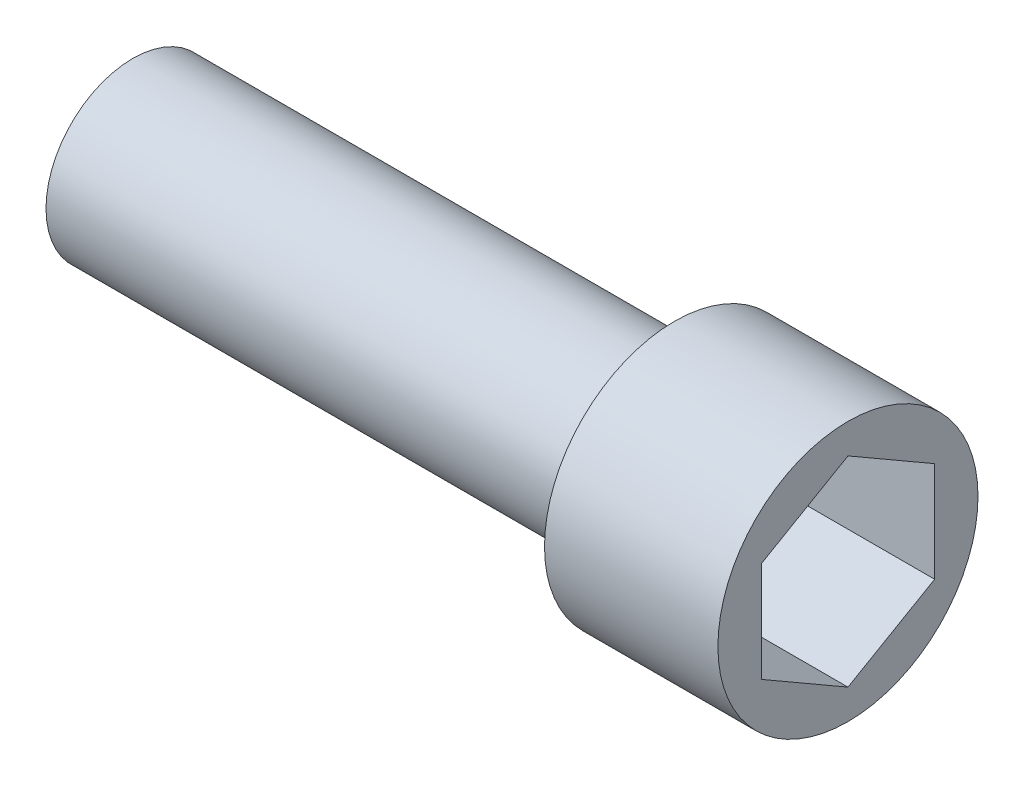
ISO-10303-21;
HEADER;
FILE_DESCRIPTION(('STEP AP214'),'2;1');
FILE_NAME('part.step','',(''),(''),'','','');
FILE_SCHEMA(('AUTOMOTIVE_DESIGN { 1 0 10303 214 1 1 1 1 }'));
ENDSEC;
DATA;
#1=APPLICATION_CONTEXT('core data for automotive mechanical design processes');
#2=APPLICATION_PROTOCOL_DEFINITION('international standard','automotive_design',2000,#1);
#3=PRODUCT_CONTEXT('',#1,'mechanical');
#4=PRODUCT('Part','Part','',(#3));
#5=PRODUCT_RELATED_PRODUCT_CATEGORY('part','',(#4));
#6=PRODUCT_DEFINITION_FORMATION('','',#4);
#7=PRODUCT_DEFINITION_CONTEXT('part definition',#1,'design');
#8=PRODUCT_DEFINITION('design','',#6,#7);
#9=PRODUCT_DEFINITION_SHAPE('','',#8);
#10=(LENGTH_UNIT() NAMED_UNIT(*) SI_UNIT(.MILLI.,.METRE.));
#11=(NAMED_UNIT(*) PLANE_ANGLE_UNIT() SI_UNIT($,.RADIAN.));
#12=(NAMED_UNIT(*) SI_UNIT($,.STERADIAN.) SOLID_ANGLE_UNIT());
#13=UNCERTAINTY_MEASURE_WITH_UNIT(LENGTH_MEASURE(1.E-05),#10,'distance_accuracy_value','');
#14=(GEOMETRIC_REPRESENTATION_CONTEXT(3) GLOBAL_UNCERTAINTY_ASSIGNED_CONTEXT((#13)) GLOBAL_UNIT_ASSIGNED_CONTEXT((#10,
#11,#12)) REPRESENTATION_CONTEXT('',''));
#15=CARTESIAN_POINT('',(0.,0.,0.));
#16=DIRECTION('',(0.,0.,1.));
#17=DIRECTION('',(1.,0.,0.));
#18=AXIS2_PLACEMENT_3D('',#15,#16,#17);
#19=CARTESIAN_POINT('',(8.,0.,0.));
#20=DIRECTION('',(-1.,0.,0.));
#21=DIRECTION('',(0.,0.,1.));
#22=AXIS2_PLACEMENT_3D('',#19,#20,#21);
#23=CYLINDRICAL_SURFACE('',#22,6.);
#24=CARTESIAN_POINT('',(8.,0.,0.));
#25=DIRECTION('',(1.,0.,0.));
#26=DIRECTION('',(0.,0.,-1.));
#27=AXIS2_PLACEMENT_3D('',#24,#25,#26);
#28=CIRCLE('',#27,6.);
#29=CARTESIAN_POINT('',(8.,0.,-6.));
#30=VERTEX_POINT('',#29);
#31=EDGE_CURVE('E54',#30,#30,#28,.T.);
#32=ORIENTED_EDGE('',*,*,#31,.F.);
#33=EDGE_LOOP('',(#32));
#34=FACE_BOUND('',#33,.T.);
#35=CARTESIAN_POINT('',(0.,0.,0.));
#36=DIRECTION('',(1.,0.,0.));
#37=DIRECTION('',(0.,0.,-1.));
#38=AXIS2_PLACEMENT_3D('',#35,#36,#37);
#39=CIRCLE('',#38,6.);
#40=CARTESIAN_POINT('',(0.,0.,-6.));
#41=VERTEX_POINT('',#40);
#42=EDGE_CURVE('E48',#41,#41,#39,.T.);
#43=ORIENTED_EDGE('',*,*,#42,.T.);
#44=EDGE_LOOP('',(#43));
#45=FACE_BOUND('',#44,.T.);
#46=ADVANCED_FACE('F45',(#34,#45),#23,.T.);
#47=CARTESIAN_POINT('',(8.,0.,0.));
#48=DIRECTION('',(1.,0.,0.));
#49=DIRECTION('',(0.,0.,-1.));
#50=AXIS2_PLACEMENT_3D('',#47,#48,#49);
#51=PLANE('',#50);
#52=DIRECTION('',(0.,1.,0.));
#53=VECTOR('',#52,1.);
#54=CARTESIAN_POINT('',(8.,-2.3094010767585,-4.));
#55=LINE('',#54,#53);
#56=CARTESIAN_POINT('',(8.,-2.3094010767585,-4.));
#57=VERTEX_POINT('',#56);
#58=CARTESIAN_POINT('',(8.,2.3094010767585,-4.));
#59=VERTEX_POINT('',#58);
#60=EDGE_CURVE('E62',#57,#59,#55,.T.);
#61=ORIENTED_EDGE('',*,*,#60,.F.);
#62=DIRECTION('',(0.,0.5,-0.866025403784439));
#63=VECTOR('',#62,1.);
#64=CARTESIAN_POINT('',(8.,-4.61880215351701,0.));
#65=LINE('',#64,#63);
#66=CARTESIAN_POINT('',(8.,-4.61880215351701,0.));
#67=VERTEX_POINT('',#66);
#68=EDGE_CURVE('E155',#67,#57,#65,.T.);
#69=ORIENTED_EDGE('',*,*,#68,.F.);
#70=DIRECTION('',(0.,-0.5,-0.866025403784439));
#71=VECTOR('',#70,1.);
#72=CARTESIAN_POINT('',(8.,-2.3094010767585,4.));
#73=LINE('',#72,#71);
#74=CARTESIAN_POINT('',(8.,-2.3094010767585,4.));
#75=VERTEX_POINT('',#74);
#76=EDGE_CURVE('E152',#75,#67,#73,.T.);
#77=ORIENTED_EDGE('',*,*,#76,.F.);
#78=DIRECTION('',(0.,-1.,0.));
#79=VECTOR('',#78,1.);
#80=CARTESIAN_POINT('',(8.,2.3094010767585,4.));
#81=LINE('',#80,#79);
#82=CARTESIAN_POINT('',(8.,2.3094010767585,4.));
#83=VERTEX_POINT('',#82);
#84=EDGE_CURVE('E110',#83,#75,#81,.T.);
#85=ORIENTED_EDGE('',*,*,#84,.F.);
#86=DIRECTION('',(0.,-0.5,0.866025403784439));
#87=VECTOR('',#86,1.);
#88=CARTESIAN_POINT('',(8.,4.61880215351701,0.));
#89=LINE('',#88,#87);
#90=CARTESIAN_POINT('',(8.,4.61880215351701,0.));
#91=VERTEX_POINT('',#90);
#92=EDGE_CURVE('E146',#91,#83,#89,.T.);
#93=ORIENTED_EDGE('',*,*,#92,.F.);
#94=DIRECTION('',(0.,0.5,0.866025403784439));
#95=VECTOR('',#94,1.);
#96=CARTESIAN_POINT('',(8.,2.3094010767585,-4.));
#97=LINE('',#96,#95);
#98=EDGE_CURVE('E142',#59,#91,#97,.T.);
#99=ORIENTED_EDGE('',*,*,#98,.F.);
#100=EDGE_LOOP('',(#61,#69,#77,#85,#93,#99));
#101=FACE_BOUND('',#100,.T.);
#102=ORIENTED_EDGE('',*,*,#31,.T.);
#103=EDGE_LOOP('',(#102));
#104=FACE_BOUND('',#103,.T.);
#105=ADVANCED_FACE('F185',(#101,#104),#51,.T.);
#106=CARTESIAN_POINT('',(0.,0.,0.));
#107=DIRECTION('',(1.,0.,0.));
#108=DIRECTION('',(0.,0.,-1.));
#109=AXIS2_PLACEMENT_3D('',#106,#107,#108);
#110=PLANE('',#109);
#111=CARTESIAN_POINT('',(0.,0.,0.));
#112=DIRECTION('',(-1.,0.,0.));
#113=DIRECTION('',(0.,0.,1.));
#114=AXIS2_PLACEMENT_3D('',#111,#112,#113);
#115=CIRCLE('',#114,4.);
#116=CARTESIAN_POINT('',(0.,0.,4.));
#117=VERTEX_POINT('',#116);
#118=EDGE_CURVE('E11',#117,#117,#115,.T.);
#119=ORIENTED_EDGE('',*,*,#118,.F.);
#120=EDGE_LOOP('',(#119));
#121=FACE_BOUND('',#120,.T.);
#122=ORIENTED_EDGE('',*,*,#42,.F.);
#123=EDGE_LOOP('',(#122));
#124=FACE_BOUND('',#123,.T.);
#125=ADVANCED_FACE('F182',(#121,#124),#110,.F.);
#126=CARTESIAN_POINT('',(-25.,0.,0.));
#127=DIRECTION('',(1.,0.,0.));
#128=DIRECTION('',(0.,0.,-1.));
#129=AXIS2_PLACEMENT_3D('',#126,#127,#128);
#130=CYLINDRICAL_SURFACE('',#129,4.);
#131=CARTESIAN_POINT('',(-25.,0.,0.));
#132=DIRECTION('',(-1.,0.,0.));
#133=DIRECTION('',(0.,0.,1.));
#134=AXIS2_PLACEMENT_3D('',#131,#132,#133);
#135=CIRCLE('',#134,4.);
#136=CARTESIAN_POINT('',(-25.,0.,4.));
#137=VERTEX_POINT('',#136);
#138=EDGE_CURVE('E161',#137,#137,#135,.T.);
#139=ORIENTED_EDGE('',*,*,#138,.F.);
#140=EDGE_LOOP('',(#139));
#141=FACE_BOUND('',#140,.T.);
#142=ORIENTED_EDGE('',*,*,#118,.T.);
#143=EDGE_LOOP('',(#142));
#144=FACE_BOUND('',#143,.T.);
#145=ADVANCED_FACE('F184',(#141,#144),#130,.T.);
#146=CARTESIAN_POINT('',(-25.,0.,0.));
#147=DIRECTION('',(-1.,0.,0.));
#148=DIRECTION('',(0.,0.,1.));
#149=AXIS2_PLACEMENT_3D('',#146,#147,#148);
#150=PLANE('',#149);
#151=ORIENTED_EDGE('',*,*,#138,.T.);
#152=EDGE_LOOP('',(#151));
#153=FACE_BOUND('',#152,.T.);
#154=ADVANCED_FACE('F191',(#153),#150,.T.);
#155=CARTESIAN_POINT('',(1.,-2.3094010767585,-4.));
#156=DIRECTION('',(0.,0.,-1.));
#157=DIRECTION('',(-1.,0.,0.));
#158=AXIS2_PLACEMENT_3D('',#155,#156,#157);
#159=PLANE('',#158);
#160=ORIENTED_EDGE('',*,*,#60,.T.);
#161=DIRECTION('',(1.,0.,0.));
#162=VECTOR('',#161,1.);
#163=CARTESIAN_POINT('',(1.,2.3094010767585,-4.));
#164=LINE('',#163,#162);
#165=CARTESIAN_POINT('',(1.,2.3094010767585,-4.));
#166=VERTEX_POINT('',#165);
#167=EDGE_CURVE('E92',#166,#59,#164,.T.);
#168=ORIENTED_EDGE('',*,*,#167,.F.);
#169=DIRECTION('',(0.,1.,0.));
#170=VECTOR('',#169,1.);
#171=CARTESIAN_POINT('',(1.,-2.3094010767585,-4.));
#172=LINE('',#171,#170);
#173=CARTESIAN_POINT('',(1.,-2.3094010767585,-4.));
#174=VERTEX_POINT('',#173);
#175=EDGE_CURVE('E158',#174,#166,#172,.T.);
#176=ORIENTED_EDGE('',*,*,#175,.F.);
#177=DIRECTION('',(1.,0.,0.));
#178=VECTOR('',#177,1.);
#179=CARTESIAN_POINT('',(1.,-2.3094010767585,-4.));
#180=LINE('',#179,#178);
#181=EDGE_CURVE('E70',#174,#57,#180,.T.);
#182=ORIENTED_EDGE('',*,*,#181,.T.);
#183=EDGE_LOOP('',(#160,#168,#176,#182));
#184=FACE_BOUND('',#183,.T.);
#185=ADVANCED_FACE('F228',(#184),#159,.F.);
#186=CARTESIAN_POINT('',(1.,-4.61880215351701,0.));
#187=DIRECTION('',(0.,-0.866025403784439,-0.5));
#188=DIRECTION('',(0.,0.5,-0.866025403784439));
#189=AXIS2_PLACEMENT_3D('',#186,#187,#188);
#190=PLANE('',#189);
#191=ORIENTED_EDGE('',*,*,#68,.T.);
#192=ORIENTED_EDGE('',*,*,#181,.F.);
#193=DIRECTION('',(0.,0.5,-0.866025403784439));
#194=VECTOR('',#193,1.);
#195=CARTESIAN_POINT('',(1.,-4.61880215351701,0.));
#196=LINE('',#195,#194);
#197=CARTESIAN_POINT('',(1.,-4.61880215351701,0.));
#198=VERTEX_POINT('',#197);
#199=EDGE_CURVE('E124',#198,#174,#196,.T.);
#200=ORIENTED_EDGE('',*,*,#199,.F.);
#201=DIRECTION('',(1.,0.,0.));
#202=VECTOR('',#201,1.);
#203=CARTESIAN_POINT('',(1.,-4.61880215351701,0.));
#204=LINE('',#203,#202);
#205=EDGE_CURVE('E115',#198,#67,#204,.T.);
#206=ORIENTED_EDGE('',*,*,#205,.T.);
#207=EDGE_LOOP('',(#191,#192,#200,#206));
#208=FACE_BOUND('',#207,.T.);
#209=ADVANCED_FACE('F237',(#208),#190,.F.);
#210=CARTESIAN_POINT('',(1.,-2.3094010767585,4.));
#211=DIRECTION('',(0.,-0.866025403784438,0.5));
#212=DIRECTION('',(0.,-0.5,-0.866025403784439));
#213=AXIS2_PLACEMENT_3D('',#210,#211,#212);
#214=PLANE('',#213);
#215=ORIENTED_EDGE('',*,*,#76,.T.);
#216=ORIENTED_EDGE('',*,*,#205,.F.);
#217=DIRECTION('',(0.,-0.5,-0.866025403784439));
#218=VECTOR('',#217,1.);
#219=CARTESIAN_POINT('',(1.,-2.3094010767585,4.));
#220=LINE('',#219,#218);
#221=CARTESIAN_POINT('',(1.,-2.3094010767585,4.));
#222=VERTEX_POINT('',#221);
#223=EDGE_CURVE('E119',#222,#198,#220,.T.);
#224=ORIENTED_EDGE('',*,*,#223,.F.);
#225=DIRECTION('',(1.,0.,0.));
#226=VECTOR('',#225,1.);
#227=CARTESIAN_POINT('',(1.,-2.3094010767585,4.));
#228=LINE('',#227,#226);
#229=EDGE_CURVE('E103',#222,#75,#228,.T.);
#230=ORIENTED_EDGE('',*,*,#229,.T.);
#231=EDGE_LOOP('',(#215,#216,#224,#230));
#232=FACE_BOUND('',#231,.T.);
#233=ADVANCED_FACE('F120',(#232),#214,.F.);
#234=CARTESIAN_POINT('',(1.,2.3094010767585,4.));
#235=DIRECTION('',(0.,0.,1.));
#236=DIRECTION('',(1.,0.,0.));
#237=AXIS2_PLACEMENT_3D('',#234,#235,#236);
#238=PLANE('',#237);
#239=ORIENTED_EDGE('',*,*,#84,.T.);
#240=ORIENTED_EDGE('',*,*,#229,.F.);
#241=DIRECTION('',(0.,-1.,0.));
#242=VECTOR('',#241,1.);
#243=CARTESIAN_POINT('',(1.,2.3094010767585,4.));
#244=LINE('',#243,#242);
#245=CARTESIAN_POINT('',(1.,2.3094010767585,4.));
#246=VERTEX_POINT('',#245);
#247=EDGE_CURVE('E107',#246,#222,#244,.T.);
#248=ORIENTED_EDGE('',*,*,#247,.F.);
#249=DIRECTION('',(1.,0.,0.));
#250=VECTOR('',#249,1.);
#251=CARTESIAN_POINT('',(1.,2.3094010767585,4.));
#252=LINE('',#251,#250);
#253=EDGE_CURVE('E116',#246,#83,#252,.T.);
#254=ORIENTED_EDGE('',*,*,#253,.T.);
#255=EDGE_LOOP('',(#239,#240,#248,#254));
#256=FACE_BOUND('',#255,.T.);
#257=ADVANCED_FACE('F105',(#256),#238,.F.);
#258=CARTESIAN_POINT('',(1.,4.61880215351701,0.));
#259=DIRECTION('',(0.,0.866025403784439,0.5));
#260=DIRECTION('',(0.,-0.5,0.866025403784439));
#261=AXIS2_PLACEMENT_3D('',#258,#259,#260);
#262=PLANE('',#261);
#263=ORIENTED_EDGE('',*,*,#92,.T.);
#264=ORIENTED_EDGE('',*,*,#253,.F.);
#265=DIRECTION('',(0.,-0.5,0.866025403784439));
#266=VECTOR('',#265,1.);
#267=CARTESIAN_POINT('',(1.,4.61880215351701,0.));
#268=LINE('',#267,#266);
#269=CARTESIAN_POINT('',(1.,4.61880215351701,0.));
#270=VERTEX_POINT('',#269);
#271=EDGE_CURVE('E130',#270,#246,#268,.T.);
#272=ORIENTED_EDGE('',*,*,#271,.F.);
#273=DIRECTION('',(1.,0.,0.));
#274=VECTOR('',#273,1.);
#275=CARTESIAN_POINT('',(1.,4.61880215351701,0.));
#276=LINE('',#275,#274);
#277=EDGE_CURVE('E166',#270,#91,#276,.T.);
#278=ORIENTED_EDGE('',*,*,#277,.T.);
#279=EDGE_LOOP('',(#263,#264,#272,#278));
#280=FACE_BOUND('',#279,.T.);
#281=ADVANCED_FACE('F262',(#280),#262,.F.);
#282=CARTESIAN_POINT('',(1.,2.3094010767585,-4.));
#283=DIRECTION('',(0.,0.866025403784438,-0.5));
#284=DIRECTION('',(0.,0.5,0.866025403784439));
#285=AXIS2_PLACEMENT_3D('',#282,#283,#284);
#286=PLANE('',#285);
#287=ORIENTED_EDGE('',*,*,#98,.T.);
#288=ORIENTED_EDGE('',*,*,#277,.F.);
#289=DIRECTION('',(0.,0.5,0.866025403784439));
#290=VECTOR('',#289,1.);
#291=CARTESIAN_POINT('',(1.,2.3094010767585,-4.));
#292=LINE('',#291,#290);
#293=EDGE_CURVE('E134',#166,#270,#292,.T.);
#294=ORIENTED_EDGE('',*,*,#293,.F.);
#295=ORIENTED_EDGE('',*,*,#167,.T.);
#296=EDGE_LOOP('',(#287,#288,#294,#295));
#297=FACE_BOUND('',#296,.T.);
#298=ADVANCED_FACE('F271',(#297),#286,.F.);
#299=CARTESIAN_POINT('',(1.,0.,0.));
#300=DIRECTION('',(1.,0.,0.));
#301=DIRECTION('',(0.,0.,-1.));
#302=AXIS2_PLACEMENT_3D('',#299,#300,#301);
#303=PLANE('',#302);
#304=ORIENTED_EDGE('',*,*,#175,.T.);
#305=ORIENTED_EDGE('',*,*,#293,.T.);
#306=ORIENTED_EDGE('',*,*,#271,.T.);
#307=ORIENTED_EDGE('',*,*,#247,.T.);
#308=ORIENTED_EDGE('',*,*,#223,.T.);
#309=ORIENTED_EDGE('',*,*,#199,.T.);
#310=EDGE_LOOP('',(#304,#305,#306,#307,#308,#309));
#311=FACE_BOUND('',#310,.T.);
#312=ADVANCED_FACE('F127',(#311),#303,.T.);
#313=CLOSED_SHELL('',(#46,#105,#125,#145,#154,#185,#209,#233,#257,#281,#298,#312));
#314=MANIFOLD_SOLID_BREP('B2',#313);
#315=ADVANCED_BREP_SHAPE_REPRESENTATION('',(#18,#314),#14);
#316=SHAPE_DEFINITION_REPRESENTATION(#9,#315);
ENDSEC;
END-ISO-10303-21;
